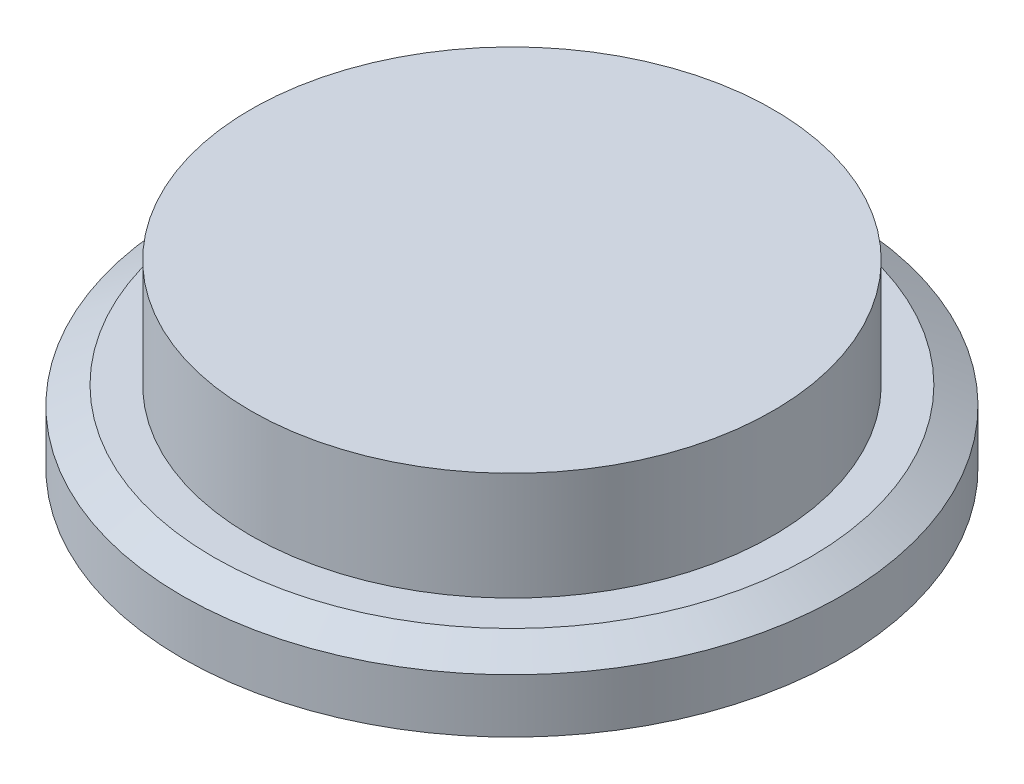
ISO-10303-21;
HEADER;
FILE_DESCRIPTION(('STEP AP214'),'2;1');
FILE_NAME('part.step','',(''),(''),'','','');
FILE_SCHEMA(('AUTOMOTIVE_DESIGN { 1 0 10303 214 1 1 1 1 }'));
ENDSEC;
DATA;
#1=APPLICATION_CONTEXT('core data for automotive mechanical design processes');
#2=APPLICATION_PROTOCOL_DEFINITION('international standard','automotive_design',2000,#1);
#3=PRODUCT_CONTEXT('',#1,'mechanical');
#4=PRODUCT('Part','Part','',(#3));
#5=PRODUCT_RELATED_PRODUCT_CATEGORY('part','',(#4));
#6=PRODUCT_DEFINITION_FORMATION('','',#4);
#7=PRODUCT_DEFINITION_CONTEXT('part definition',#1,'design');
#8=PRODUCT_DEFINITION('design','',#6,#7);
#9=PRODUCT_DEFINITION_SHAPE('','',#8);
#10=(LENGTH_UNIT() NAMED_UNIT(*) SI_UNIT(.MILLI.,.METRE.));
#11=(NAMED_UNIT(*) PLANE_ANGLE_UNIT() SI_UNIT($,.RADIAN.));
#12=(NAMED_UNIT(*) SI_UNIT($,.STERADIAN.) SOLID_ANGLE_UNIT());
#13=UNCERTAINTY_MEASURE_WITH_UNIT(LENGTH_MEASURE(1.E-05),#10,'distance_accuracy_value','');
#14=(GEOMETRIC_REPRESENTATION_CONTEXT(3) GLOBAL_UNCERTAINTY_ASSIGNED_CONTEXT((#13)) GLOBAL_UNIT_ASSIGNED_CONTEXT((#10,
#11,#12)) REPRESENTATION_CONTEXT('',''));
#15=CARTESIAN_POINT('',(0.,0.,0.));
#16=DIRECTION('',(0.,0.,1.));
#17=DIRECTION('',(1.,0.,0.));
#18=AXIS2_PLACEMENT_3D('',#15,#16,#17);
#19=CARTESIAN_POINT('',(0.,1.,0.));
#20=DIRECTION('',(0.,-1.,0.));
#21=DIRECTION('',(0.,0.,-1.));
#22=AXIS2_PLACEMENT_3D('',#19,#20,#21);
#23=CYLINDRICAL_SURFACE('',#22,6.);
#24=CARTESIAN_POINT('',(0.,1.,0.));
#25=DIRECTION('',(0.,1.,0.));
#26=DIRECTION('',(0.,0.,1.));
#27=AXIS2_PLACEMENT_3D('',#24,#25,#26);
#28=CIRCLE('',#27,6.);
#29=CARTESIAN_POINT('',(0.,1.,6.));
#30=VERTEX_POINT('',#29);
#31=EDGE_CURVE('E51',#30,#30,#28,.T.);
#32=ORIENTED_EDGE('',*,*,#31,.F.);
#33=EDGE_LOOP('',(#32));
#34=FACE_BOUND('',#33,.T.);
#35=CARTESIAN_POINT('',(0.,0.,0.));
#36=DIRECTION('',(0.,1.,0.));
#37=DIRECTION('',(0.,0.,1.));
#38=AXIS2_PLACEMENT_3D('',#35,#36,#37);
#39=CIRCLE('',#38,6.);
#40=CARTESIAN_POINT('',(0.,0.,6.));
#41=VERTEX_POINT('',#40);
#42=EDGE_CURVE('E50',#41,#41,#39,.T.);
#43=ORIENTED_EDGE('',*,*,#42,.T.);
#44=EDGE_LOOP('',(#43));
#45=FACE_BOUND('',#44,.T.);
#46=ADVANCED_FACE('F31',(#34,#45),#23,.T.);
#47=CARTESIAN_POINT('',(0.,0.,0.));
#48=DIRECTION('',(0.,1.,0.));
#49=DIRECTION('',(0.,0.,1.));
#50=AXIS2_PLACEMENT_3D('',#47,#48,#49);
#51=PLANE('',#50);
#52=ORIENTED_EDGE('',*,*,#42,.F.);
#53=EDGE_LOOP('',(#52));
#54=FACE_BOUND('',#53,.T.);
#55=ADVANCED_FACE('F75',(#54),#51,.F.);
#56=CARTESIAN_POINT('',(0.,3.,0.));
#57=DIRECTION('',(0.,-1.,0.));
#58=DIRECTION('',(0.,0.,-1.));
#59=AXIS2_PLACEMENT_3D('',#56,#57,#58);
#60=CYLINDRICAL_SURFACE('',#59,9.15);
#61=CARTESIAN_POINT('',(0.,2.49999999999999,0.));
#62=DIRECTION('',(0.,1.,0.));
#63=DIRECTION('',(0.,0.,1.));
#64=AXIS2_PLACEMENT_3D('',#61,#62,#63);
#65=CIRCLE('',#64,9.15);
#66=CARTESIAN_POINT('',(0.,2.49999999999999,9.15));
#67=VERTEX_POINT('',#66);
#68=EDGE_CURVE('E35',#67,#67,#65,.F.);
#69=ORIENTED_EDGE('',*,*,#68,.T.);
#70=EDGE_LOOP('',(#69));
#71=FACE_BOUND('',#70,.T.);
#72=CARTESIAN_POINT('',(0.,1.,0.));
#73=DIRECTION('',(0.,1.,0.));
#74=DIRECTION('',(0.,0.,1.));
#75=AXIS2_PLACEMENT_3D('',#72,#73,#74);
#76=CIRCLE('',#75,9.15);
#77=CARTESIAN_POINT('',(0.,1.,9.15));
#78=VERTEX_POINT('',#77);
#79=EDGE_CURVE('E47',#78,#78,#76,.T.);
#80=ORIENTED_EDGE('',*,*,#79,.T.);
#81=EDGE_LOOP('',(#80));
#82=FACE_BOUND('',#81,.T.);
#83=ADVANCED_FACE('F80',(#71,#82),#60,.T.);
#84=CARTESIAN_POINT('',(0.,3.,0.));
#85=DIRECTION('',(0.,1.,0.));
#86=DIRECTION('',(0.,0.,1.));
#87=AXIS2_PLACEMENT_3D('',#84,#85,#86);
#88=PLANE('',#87);
#89=CARTESIAN_POINT('',(0.,3.,0.));
#90=DIRECTION('',(0.,1.,0.));
#91=DIRECTION('',(0.,0.,1.));
#92=AXIS2_PLACEMENT_3D('',#89,#90,#91);
#93=CIRCLE('',#92,7.25);
#94=CARTESIAN_POINT('',(0.,3.,7.25));
#95=VERTEX_POINT('',#94);
#96=EDGE_CURVE('E10',#95,#95,#93,.T.);
#97=ORIENTED_EDGE('',*,*,#96,.F.);
#98=EDGE_LOOP('',(#97));
#99=FACE_BOUND('',#98,.T.);
#100=CARTESIAN_POINT('',(0.,3.,0.));
#101=DIRECTION('',(0.,1.,0.));
#102=DIRECTION('',(0.,0.,1.));
#103=AXIS2_PLACEMENT_3D('',#100,#101,#102);
#104=CIRCLE('',#103,8.28397459621555);
#105=CARTESIAN_POINT('',(0.,3.,8.28397459621555));
#106=VERTEX_POINT('',#105);
#107=EDGE_CURVE('E43',#106,#106,#104,.T.);
#108=ORIENTED_EDGE('',*,*,#107,.T.);
#109=EDGE_LOOP('',(#108));
#110=FACE_BOUND('',#109,.T.);
#111=ADVANCED_FACE('F58',(#99,#110),#88,.T.);
#112=CARTESIAN_POINT('',(0.,1.,0.));
#113=DIRECTION('',(0.,1.,0.));
#114=DIRECTION('',(0.,0.,1.));
#115=AXIS2_PLACEMENT_3D('',#112,#113,#114);
#116=PLANE('',#115);
#117=ORIENTED_EDGE('',*,*,#31,.T.);
#118=EDGE_LOOP('',(#117));
#119=FACE_BOUND('',#118,.T.);
#120=ORIENTED_EDGE('',*,*,#79,.F.);
#121=EDGE_LOOP('',(#120));
#122=FACE_BOUND('',#121,.T.);
#123=ADVANCED_FACE('F62',(#119,#122),#116,.F.);
#124=CARTESIAN_POINT('',(0.,3.,0.));
#125=DIRECTION('',(0.,-1.,0.));
#126=DIRECTION('',(0.,0.,-1.));
#127=AXIS2_PLACEMENT_3D('',#124,#125,#126);
#128=CONICAL_SURFACE('',#127,8.28397459621555,1.0471975511966);
#129=ORIENTED_EDGE('',*,*,#68,.F.);
#130=EDGE_LOOP('',(#129));
#131=FACE_BOUND('',#130,.T.);
#132=ORIENTED_EDGE('',*,*,#107,.F.);
#133=EDGE_LOOP('',(#132));
#134=FACE_BOUND('',#133,.T.);
#135=ADVANCED_FACE('F33',(#131,#134),#128,.T.);
#136=CARTESIAN_POINT('',(0.,6.,0.));
#137=DIRECTION('',(0.,-1.,0.));
#138=DIRECTION('',(0.,0.,-1.));
#139=AXIS2_PLACEMENT_3D('',#136,#137,#138);
#140=CYLINDRICAL_SURFACE('',#139,7.25);
#141=CARTESIAN_POINT('',(0.,6.,0.));
#142=DIRECTION('',(0.,1.,0.));
#143=DIRECTION('',(0.,0.,1.));
#144=AXIS2_PLACEMENT_3D('',#141,#142,#143);
#145=CIRCLE('',#144,7.25);
#146=CARTESIAN_POINT('',(0.,6.,7.25));
#147=VERTEX_POINT('',#146);
#148=EDGE_CURVE('E46',#147,#147,#145,.T.);
#149=ORIENTED_EDGE('',*,*,#148,.F.);
#150=EDGE_LOOP('',(#149));
#151=FACE_BOUND('',#150,.T.);
#152=ORIENTED_EDGE('',*,*,#96,.T.);
#153=EDGE_LOOP('',(#152));
#154=FACE_BOUND('',#153,.T.);
#155=ADVANCED_FACE('F61',(#151,#154),#140,.T.);
#156=CARTESIAN_POINT('',(0.,6.,0.));
#157=DIRECTION('',(0.,1.,0.));
#158=DIRECTION('',(0.,0.,1.));
#159=AXIS2_PLACEMENT_3D('',#156,#157,#158);
#160=PLANE('',#159);
#161=ORIENTED_EDGE('',*,*,#148,.T.);
#162=EDGE_LOOP('',(#161));
#163=FACE_BOUND('',#162,.T.);
#164=ADVANCED_FACE('F68',(#163),#160,.T.);
#165=CLOSED_SHELL('',(#46,#55,#83,#111,#123,#135,#155,#164));
#166=MANIFOLD_SOLID_BREP('B2',#165);
#167=ADVANCED_BREP_SHAPE_REPRESENTATION('',(#18,#166),#14);
#168=SHAPE_DEFINITION_REPRESENTATION(#9,#167);
ENDSEC;
END-ISO-10303-21;
